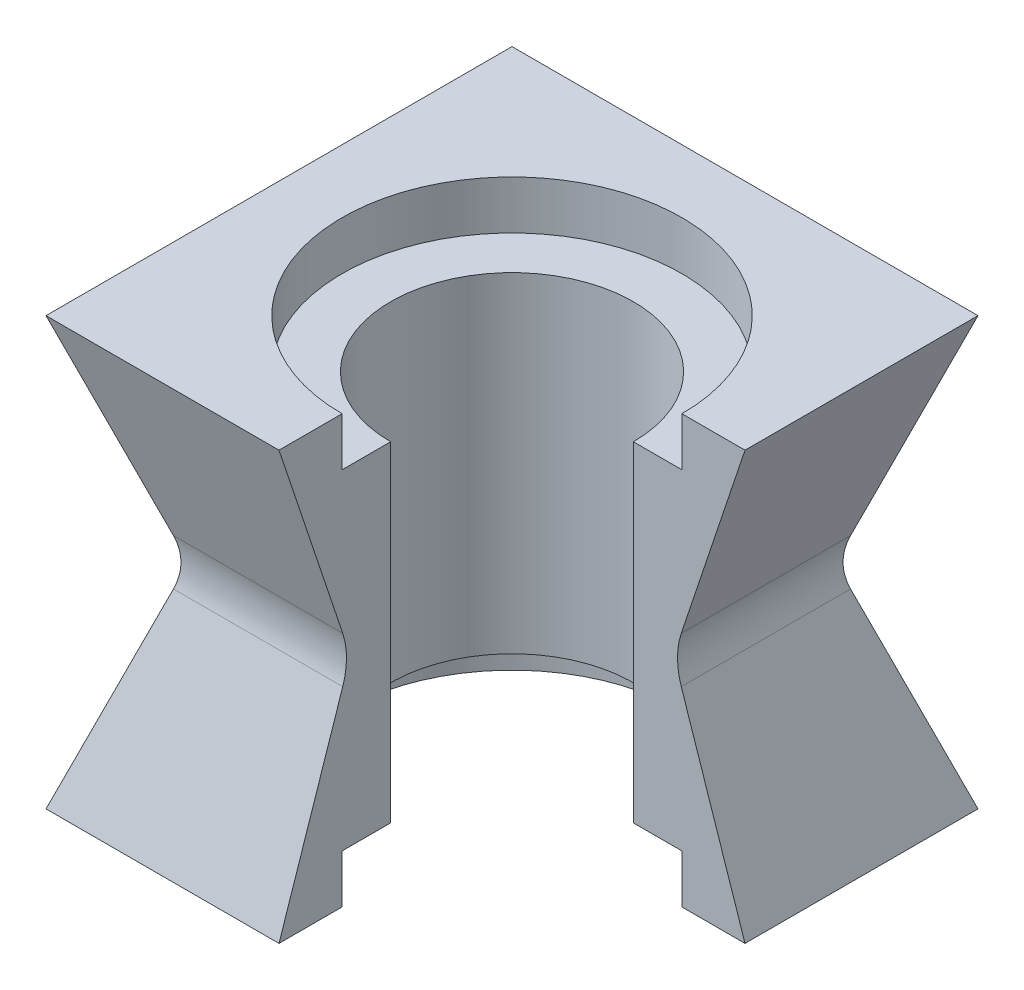
ISO-10303-21;
HEADER;
FILE_DESCRIPTION(('STEP AP214'),'2;1');
FILE_NAME('part.step','',(''),(''),'','','');
FILE_SCHEMA(('AUTOMOTIVE_DESIGN { 1 0 10303 214 1 1 1 1 }'));
ENDSEC;
DATA;
#1=APPLICATION_CONTEXT('core data for automotive mechanical design processes');
#2=APPLICATION_PROTOCOL_DEFINITION('international standard','automotive_design',2000,#1);
#3=PRODUCT_CONTEXT('',#1,'mechanical');
#4=PRODUCT('Part','Part','',(#3));
#5=PRODUCT_RELATED_PRODUCT_CATEGORY('part','',(#4));
#6=PRODUCT_DEFINITION_FORMATION('','',#4);
#7=PRODUCT_DEFINITION_CONTEXT('part definition',#1,'design');
#8=PRODUCT_DEFINITION('design','',#6,#7);
#9=PRODUCT_DEFINITION_SHAPE('','',#8);
#10=(LENGTH_UNIT() NAMED_UNIT(*) SI_UNIT(.MILLI.,.METRE.));
#11=(NAMED_UNIT(*) PLANE_ANGLE_UNIT() SI_UNIT($,.RADIAN.));
#12=(NAMED_UNIT(*) SI_UNIT($,.STERADIAN.) SOLID_ANGLE_UNIT());
#13=UNCERTAINTY_MEASURE_WITH_UNIT(LENGTH_MEASURE(1.E-05),#10,'distance_accuracy_value','');
#14=(GEOMETRIC_REPRESENTATION_CONTEXT(3) GLOBAL_UNCERTAINTY_ASSIGNED_CONTEXT((#13)) GLOBAL_UNIT_ASSIGNED_CONTEXT((#10,
#11,#12)) REPRESENTATION_CONTEXT('',''));
#15=CARTESIAN_POINT('',(0.,0.,0.));
#16=DIRECTION('',(0.,0.,1.));
#17=DIRECTION('',(1.,0.,0.));
#18=AXIS2_PLACEMENT_3D('',#15,#16,#17);
#19=CARTESIAN_POINT('',(0.,-44.,0.));
#20=DIRECTION('',(0.,1.,0.));
#21=DIRECTION('',(0.,0.,1.));
#22=AXIS2_PLACEMENT_3D('',#19,#20,#21);
#23=CYLINDRICAL_SURFACE('',#22,25.);
#24=CARTESIAN_POINT('',(0.,-34.,0.));
#25=DIRECTION('',(0.,-1.,0.));
#26=DIRECTION('',(0.,0.,-1.));
#27=AXIS2_PLACEMENT_3D('',#24,#25,#26);
#28=CIRCLE('',#27,25.);
#29=CARTESIAN_POINT('',(0.,-34.,25.));
#30=VERTEX_POINT('',#29);
#31=CARTESIAN_POINT('',(25.,-34.,0.));
#32=VERTEX_POINT('',#31);
#33=EDGE_CURVE('E52',#30,#32,#28,.T.);
#34=ORIENTED_EDGE('',*,*,#33,.T.);
#35=DIRECTION('',(0.,1.,0.));
#36=VECTOR('',#35,1.);
#37=CARTESIAN_POINT('',(25.,-44.,0.));
#38=LINE('',#37,#36);
#39=CARTESIAN_POINT('',(25.,34.,0.));
#40=VERTEX_POINT('',#39);
#41=EDGE_CURVE('E159',#32,#40,#38,.T.);
#42=ORIENTED_EDGE('',*,*,#41,.T.);
#43=CARTESIAN_POINT('',(0.,34.,0.));
#44=DIRECTION('',(0.,1.,0.));
#45=DIRECTION('',(0.,0.,1.));
#46=AXIS2_PLACEMENT_3D('',#43,#44,#45);
#47=CIRCLE('',#46,25.);
#48=CARTESIAN_POINT('',(0.,34.,25.));
#49=VERTEX_POINT('',#48);
#50=EDGE_CURVE('E293',#49,#40,#47,.F.);
#51=ORIENTED_EDGE('',*,*,#50,.F.);
#52=DIRECTION('',(0.,1.,0.));
#53=VECTOR('',#52,1.);
#54=CARTESIAN_POINT('',(0.,-44.,25.));
#55=LINE('',#54,#53);
#56=EDGE_CURVE('E162',#49,#30,#55,.F.);
#57=ORIENTED_EDGE('',*,*,#56,.T.);
#58=EDGE_LOOP('',(#34,#42,#51,#57));
#59=FACE_BOUND('',#58,.T.);
#60=ADVANCED_FACE('F35',(#59),#23,.F.);
#61=CARTESIAN_POINT('',(-29.9273217317904,10.0135417766895,48.));
#62=DIRECTION('',(0.948323655206201,-0.317304656405087,0.));
#63=DIRECTION('',(0.317304656405087,0.948323655206201,0.));
#64=AXIS2_PLACEMENT_3D('',#61,#62,#63);
#65=PLANE('',#64);
#66=DIRECTION('',(0.302444342389869,0.903910858167284,-0.302444342389876));
#67=VECTOR('',#66,1.);
#68=CARTESIAN_POINT('',(-22.7991085415071,31.3175253497149,22.7991085415066));
#69=LINE('',#68,#67);
#70=CARTESIAN_POINT('',(-48.,-44.,48.));
#71=VERTEX_POINT('',#70);
#72=CARTESIAN_POINT('',(-34.8703357352494,-4.75956984607637,34.8703357352491));
#73=VERTEX_POINT('',#72);
#74=EDGE_CURVE('E245',#71,#73,#69,.T.);
#75=ORIENTED_EDGE('',*,*,#74,.T.);
#76=DIRECTION('',(0.,0.,-1.));
#77=VECTOR('',#76,1.);
#78=CARTESIAN_POINT('',(-34.8703357352494,-4.7595698460763,48.));
#79=LINE('',#78,#77);
#80=CARTESIAN_POINT('',(-34.8703357352494,-4.75956984607637,-34.8703357352491));
#81=VERTEX_POINT('',#80);
#82=EDGE_CURVE('E171',#73,#81,#79,.T.);
#83=ORIENTED_EDGE('',*,*,#82,.T.);
#84=DIRECTION('',(-0.302444342389869,-0.903910858167283,-0.302444342389877));
#85=VECTOR('',#84,1.);
#86=CARTESIAN_POINT('',(-22.7991085415071,31.3175253497149,-22.7991085415066));
#87=LINE('',#86,#85);
#88=CARTESIAN_POINT('',(-48.,-43.9999999999999,-48.));
#89=VERTEX_POINT('',#88);
#90=EDGE_CURVE('E243',#81,#89,#87,.T.);
#91=ORIENTED_EDGE('',*,*,#90,.T.);
#92=DIRECTION('',(0.,0.,-1.));
#93=VECTOR('',#92,1.);
#94=CARTESIAN_POINT('',(-48.,-44.,48.));
#95=LINE('',#94,#93);
#96=EDGE_CURVE('E234',#71,#89,#95,.T.);
#97=ORIENTED_EDGE('',*,*,#96,.F.);
#98=EDGE_LOOP('',(#75,#83,#91,#97));
#99=FACE_BOUND('',#98,.T.);
#100=ADVANCED_FACE('F276',(#99),#65,.F.);
#101=CARTESIAN_POINT('',(-29.9273217317904,-10.0135417766895,48.));
#102=DIRECTION('',(-0.948323655206201,-0.317304656405086,0.));
#103=DIRECTION('',(0.317304656405086,-0.948323655206201,0.));
#104=AXIS2_PLACEMENT_3D('',#101,#102,#103);
#105=PLANE('',#104);
#106=DIRECTION('',(0.302444342389869,-0.903910858167284,0.302444342389876));
#107=VECTOR('',#106,1.);
#108=CARTESIAN_POINT('',(-22.7991085415071,-31.3175253497149,-22.7991085415066));
#109=LINE('',#108,#107);
#110=CARTESIAN_POINT('',(-48.,44.,-48.));
#111=VERTEX_POINT('',#110);
#112=CARTESIAN_POINT('',(-34.8703357352494,4.75956984607644,-34.8703357352491));
#113=VERTEX_POINT('',#112);
#114=EDGE_CURVE('E248',#111,#113,#109,.T.);
#115=ORIENTED_EDGE('',*,*,#114,.T.);
#116=DIRECTION('',(0.,0.,-1.));
#117=VECTOR('',#116,1.);
#118=CARTESIAN_POINT('',(-34.8703357352494,4.7595698460763,48.));
#119=LINE('',#118,#117);
#120=CARTESIAN_POINT('',(-34.8703357352494,4.75956984607642,34.8703357352491));
#121=VERTEX_POINT('',#120);
#122=EDGE_CURVE('E180',#113,#121,#119,.F.);
#123=ORIENTED_EDGE('',*,*,#122,.T.);
#124=DIRECTION('',(-0.302444342389869,0.903910858167284,0.302444342389876));
#125=VECTOR('',#124,1.);
#126=CARTESIAN_POINT('',(-22.7991085415071,-31.3175253497149,22.7991085415066));
#127=LINE('',#126,#125);
#128=CARTESIAN_POINT('',(-48.,44.,48.));
#129=VERTEX_POINT('',#128);
#130=EDGE_CURVE('E251',#121,#129,#127,.T.);
#131=ORIENTED_EDGE('',*,*,#130,.T.);
#132=DIRECTION('',(0.,0.,-1.));
#133=VECTOR('',#132,1.);
#134=CARTESIAN_POINT('',(-48.,44.,48.));
#135=LINE('',#134,#133);
#136=EDGE_CURVE('E237',#129,#111,#135,.T.);
#137=ORIENTED_EDGE('',*,*,#136,.T.);
#138=EDGE_LOOP('',(#115,#123,#131,#137));
#139=FACE_BOUND('',#138,.T.);
#140=ADVANCED_FACE('F329',(#139),#105,.T.);
#141=CARTESIAN_POINT('',(48.,10.0135417766896,29.9273217317899));
#142=DIRECTION('',(0.,0.317304656405092,0.948323655206199));
#143=DIRECTION('',(0.,-0.948323655206199,0.317304656405092));
#144=AXIS2_PLACEMENT_3D('',#141,#142,#143);
#145=PLANE('',#144);
#146=DIRECTION('',(0.,-0.948323655206199,0.317304656405092));
#147=VECTOR('',#146,1.);
#148=CARTESIAN_POINT('',(0.,10.0135417766896,29.9273217317899));
#149=LINE('',#148,#147);
#150=CARTESIAN_POINT('',(0.,-4.75956984607637,34.8703357352491));
#151=VERTEX_POINT('',#150);
#152=CARTESIAN_POINT('',(0.,-44.,48.));
#153=VERTEX_POINT('',#152);
#154=EDGE_CURVE('E229',#151,#153,#149,.T.);
#155=ORIENTED_EDGE('',*,*,#154,.F.);
#156=DIRECTION('',(-1.,0.,0.));
#157=VECTOR('',#156,1.);
#158=CARTESIAN_POINT('',(48.,-4.75956984607637,34.8703357352491));
#159=LINE('',#158,#157);
#160=EDGE_CURVE('E190',#151,#73,#159,.T.);
#161=ORIENTED_EDGE('',*,*,#160,.T.);
#162=ORIENTED_EDGE('',*,*,#74,.F.);
#163=DIRECTION('',(-1.,0.,0.));
#164=VECTOR('',#163,1.);
#165=CARTESIAN_POINT('',(48.,-44.,48.));
#166=LINE('',#165,#164);
#167=EDGE_CURVE('E174',#153,#71,#166,.T.);
#168=ORIENTED_EDGE('',*,*,#167,.F.);
#169=EDGE_LOOP('',(#155,#161,#162,#168));
#170=FACE_BOUND('',#169,.T.);
#171=ADVANCED_FACE('F273',(#170),#145,.T.);
#172=CARTESIAN_POINT('',(48.,10.0135417766896,-29.9273217317899));
#173=DIRECTION('',(0.,0.317304656405093,-0.948323655206199));
#174=DIRECTION('',(0.,0.948323655206199,0.317304656405094));
#175=AXIS2_PLACEMENT_3D('',#172,#173,#174);
#176=PLANE('',#175);
#177=ORIENTED_EDGE('',*,*,#90,.F.);
#178=DIRECTION('',(-1.,0.,0.));
#179=VECTOR('',#178,1.);
#180=CARTESIAN_POINT('',(48.,-4.75956984607637,-34.8703357352491));
#181=LINE('',#180,#179);
#182=CARTESIAN_POINT('',(34.8703357352494,-4.75956984607628,-34.8703357352491));
#183=VERTEX_POINT('',#182);
#184=EDGE_CURVE('E184',#81,#183,#181,.F.);
#185=ORIENTED_EDGE('',*,*,#184,.T.);
#186=DIRECTION('',(-0.302444342389869,0.903910858167283,0.302444342389877));
#187=VECTOR('',#186,1.);
#188=CARTESIAN_POINT('',(31.5804762448966,5.07278374227817,-31.5804762448963));
#189=LINE('',#188,#187);
#190=CARTESIAN_POINT('',(48.,-44.,-48.));
#191=VERTEX_POINT('',#190);
#192=EDGE_CURVE('E253',#191,#183,#189,.T.);
#193=ORIENTED_EDGE('',*,*,#192,.F.);
#194=DIRECTION('',(-1.,0.,0.));
#195=VECTOR('',#194,1.);
#196=CARTESIAN_POINT('',(48.,-43.9999999999999,-48.));
#197=LINE('',#196,#195);
#198=EDGE_CURVE('E261',#191,#89,#197,.T.);
#199=ORIENTED_EDGE('',*,*,#198,.T.);
#200=EDGE_LOOP('',(#177,#185,#193,#199));
#201=FACE_BOUND('',#200,.T.);
#202=ADVANCED_FACE('F280',(#201),#176,.T.);
#203=CARTESIAN_POINT('',(48.,44.,0.));
#204=DIRECTION('',(0.,-1.,0.));
#205=DIRECTION('',(0.,0.,-1.));
#206=AXIS2_PLACEMENT_3D('',#203,#204,#205);
#207=PLANE('',#206);
#208=DIRECTION('',(0.,0.,1.));
#209=VECTOR('',#208,1.);
#210=CARTESIAN_POINT('',(0.,44.,48.));
#211=LINE('',#210,#209);
#212=CARTESIAN_POINT('',(0.,44.,35.));
#213=VERTEX_POINT('',#212);
#214=CARTESIAN_POINT('',(0.,44.,48.));
#215=VERTEX_POINT('',#214);
#216=EDGE_CURVE('E204',#213,#215,#211,.T.);
#217=ORIENTED_EDGE('',*,*,#216,.F.);
#218=CARTESIAN_POINT('',(0.,44.,0.));
#219=DIRECTION('',(0.,1.,0.));
#220=DIRECTION('',(0.,0.,1.));
#221=AXIS2_PLACEMENT_3D('',#218,#219,#220);
#222=CIRCLE('',#221,35.);
#223=CARTESIAN_POINT('',(35.,44.,0.));
#224=VERTEX_POINT('',#223);
#225=EDGE_CURVE('E295',#224,#213,#222,.T.);
#226=ORIENTED_EDGE('',*,*,#225,.F.);
#227=DIRECTION('',(-1.,0.,0.));
#228=VECTOR('',#227,1.);
#229=CARTESIAN_POINT('',(0.,44.,0.));
#230=LINE('',#229,#228);
#231=CARTESIAN_POINT('',(48.,44.,0.));
#232=VERTEX_POINT('',#231);
#233=EDGE_CURVE('E209',#232,#224,#230,.T.);
#234=ORIENTED_EDGE('',*,*,#233,.F.);
#235=DIRECTION('',(0.,0.,-1.));
#236=VECTOR('',#235,1.);
#237=CARTESIAN_POINT('',(48.,44.,48.));
#238=LINE('',#237,#236);
#239=CARTESIAN_POINT('',(48.,44.,-48.));
#240=VERTEX_POINT('',#239);
#241=EDGE_CURVE('E240',#232,#240,#238,.T.);
#242=ORIENTED_EDGE('',*,*,#241,.T.);
#243=DIRECTION('',(-1.,0.,0.));
#244=VECTOR('',#243,1.);
#245=CARTESIAN_POINT('',(48.,44.,-48.));
#246=LINE('',#245,#244);
#247=EDGE_CURVE('E258',#240,#111,#246,.T.);
#248=ORIENTED_EDGE('',*,*,#247,.T.);
#249=ORIENTED_EDGE('',*,*,#136,.F.);
#250=DIRECTION('',(-1.,0.,0.));
#251=VECTOR('',#250,1.);
#252=CARTESIAN_POINT('',(48.,44.,48.));
#253=LINE('',#252,#251);
#254=EDGE_CURVE('E169',#215,#129,#253,.T.);
#255=ORIENTED_EDGE('',*,*,#254,.F.);
#256=EDGE_LOOP('',(#217,#226,#234,#242,#248,#249,#255));
#257=FACE_BOUND('',#256,.T.);
#258=ADVANCED_FACE('F349',(#257),#207,.F.);
#259=CARTESIAN_POINT('',(48.,-10.0135417766896,29.9273217317899));
#260=DIRECTION('',(0.,0.317304656405093,-0.948323655206199));
#261=DIRECTION('',(0.,0.948323655206199,0.317304656405093));
#262=AXIS2_PLACEMENT_3D('',#259,#260,#261);
#263=PLANE('',#262);
#264=ORIENTED_EDGE('',*,*,#130,.F.);
#265=DIRECTION('',(-1.,0.,0.));
#266=VECTOR('',#265,1.);
#267=CARTESIAN_POINT('',(48.,4.75956984607641,34.8703357352491));
#268=LINE('',#267,#266);
#269=CARTESIAN_POINT('',(0.,4.75956984607641,34.8703357352491));
#270=VERTEX_POINT('',#269);
#271=EDGE_CURVE('E192',#121,#270,#268,.F.);
#272=ORIENTED_EDGE('',*,*,#271,.T.);
#273=DIRECTION('',(0.,0.948323655206199,0.317304656405093));
#274=VECTOR('',#273,1.);
#275=CARTESIAN_POINT('',(0.,-10.0135417766896,29.9273217317899));
#276=LINE('',#275,#274);
#277=EDGE_CURVE('E227',#270,#215,#276,.T.);
#278=ORIENTED_EDGE('',*,*,#277,.T.);
#279=ORIENTED_EDGE('',*,*,#254,.T.);
#280=EDGE_LOOP('',(#264,#272,#278,#279));
#281=FACE_BOUND('',#280,.T.);
#282=ADVANCED_FACE('F351',(#281),#263,.F.);
#283=CARTESIAN_POINT('',(48.,-44.,0.));
#284=DIRECTION('',(0.,-1.,0.));
#285=DIRECTION('',(0.,0.,-1.));
#286=AXIS2_PLACEMENT_3D('',#283,#284,#285);
#287=PLANE('',#286);
#288=CARTESIAN_POINT('',(0.,-44.,0.));
#289=DIRECTION('',(0.,-1.,0.));
#290=DIRECTION('',(0.,0.,-1.));
#291=AXIS2_PLACEMENT_3D('',#288,#289,#290);
#292=CIRCLE('',#291,35.);
#293=CARTESIAN_POINT('',(0.,-44.,35.));
#294=VERTEX_POINT('',#293);
#295=CARTESIAN_POINT('',(35.,-44.,0.));
#296=VERTEX_POINT('',#295);
#297=EDGE_CURVE('E163',#294,#296,#292,.T.);
#298=ORIENTED_EDGE('',*,*,#297,.F.);
#299=DIRECTION('',(0.,0.,1.));
#300=VECTOR('',#299,1.);
#301=CARTESIAN_POINT('',(0.,-44.,48.));
#302=LINE('',#301,#300);
#303=EDGE_CURVE('E217',#294,#153,#302,.T.);
#304=ORIENTED_EDGE('',*,*,#303,.T.);
#305=ORIENTED_EDGE('',*,*,#167,.T.);
#306=ORIENTED_EDGE('',*,*,#96,.T.);
#307=ORIENTED_EDGE('',*,*,#198,.F.);
#308=DIRECTION('',(0.,0.,-1.));
#309=VECTOR('',#308,1.);
#310=CARTESIAN_POINT('',(48.,-44.,48.));
#311=LINE('',#310,#309);
#312=CARTESIAN_POINT('',(48.,-44.,0.));
#313=VERTEX_POINT('',#312);
#314=EDGE_CURVE('E232',#313,#191,#311,.T.);
#315=ORIENTED_EDGE('',*,*,#314,.F.);
#316=DIRECTION('',(-1.,0.,0.));
#317=VECTOR('',#316,1.);
#318=CARTESIAN_POINT('',(0.,-44.,0.));
#319=LINE('',#318,#317);
#320=EDGE_CURVE('E220',#313,#296,#319,.T.);
#321=ORIENTED_EDGE('',*,*,#320,.T.);
#322=EDGE_LOOP('',(#298,#304,#305,#306,#307,#315,#321));
#323=FACE_BOUND('',#322,.T.);
#324=ADVANCED_FACE('F267',(#323),#287,.T.);
#325=CARTESIAN_POINT('',(48.,-10.0135417766896,-29.9273217317899));
#326=DIRECTION('',(0.,0.317304656405093,0.948323655206199));
#327=DIRECTION('',(0.,-0.948323655206199,0.317304656405093));
#328=AXIS2_PLACEMENT_3D('',#325,#326,#327);
#329=PLANE('',#328);
#330=DIRECTION('',(0.302444342389869,0.903910858167283,-0.302444342389876));
#331=VECTOR('',#330,1.);
#332=CARTESIAN_POINT('',(31.5804762448966,-5.07278374227814,-31.5804762448963));
#333=LINE('',#332,#331);
#334=CARTESIAN_POINT('',(34.8703357352494,4.75956984607631,-34.8703357352491));
#335=VERTEX_POINT('',#334);
#336=EDGE_CURVE('E256',#335,#240,#333,.T.);
#337=ORIENTED_EDGE('',*,*,#336,.F.);
#338=DIRECTION('',(-1.,0.,0.));
#339=VECTOR('',#338,1.);
#340=CARTESIAN_POINT('',(48.,4.75956984607643,-34.8703357352491));
#341=LINE('',#340,#339);
#342=EDGE_CURVE('E182',#335,#113,#341,.T.);
#343=ORIENTED_EDGE('',*,*,#342,.T.);
#344=ORIENTED_EDGE('',*,*,#114,.F.);
#345=ORIENTED_EDGE('',*,*,#247,.F.);
#346=EDGE_LOOP('',(#337,#343,#344,#345));
#347=FACE_BOUND('',#346,.T.);
#348=ADVANCED_FACE('F342',(#347),#329,.F.);
#349=CARTESIAN_POINT('',(29.9273217317904,-10.0135417766895,48.));
#350=DIRECTION('',(0.948323655206201,-0.317304656405087,0.));
#351=DIRECTION('',(0.317304656405087,0.948323655206201,0.));
#352=AXIS2_PLACEMENT_3D('',#349,#350,#351);
#353=PLANE('',#352);
#354=DIRECTION('',(0.317304656405087,0.948323655206201,0.));
#355=VECTOR('',#354,1.);
#356=CARTESIAN_POINT('',(29.9273217317904,-10.0135417766895,0.));
#357=LINE('',#356,#355);
#358=CARTESIAN_POINT('',(34.8703357352494,4.75956984607631,0.));
#359=VERTEX_POINT('',#358);
#360=EDGE_CURVE('E225',#359,#232,#357,.T.);
#361=ORIENTED_EDGE('',*,*,#360,.F.);
#362=DIRECTION('',(0.,0.,-1.));
#363=VECTOR('',#362,1.);
#364=CARTESIAN_POINT('',(34.8703357352494,4.75956984607631,48.));
#365=LINE('',#364,#363);
#366=EDGE_CURVE('E186',#359,#335,#365,.T.);
#367=ORIENTED_EDGE('',*,*,#366,.T.);
#368=ORIENTED_EDGE('',*,*,#336,.T.);
#369=ORIENTED_EDGE('',*,*,#241,.F.);
#370=EDGE_LOOP('',(#361,#367,#368,#369));
#371=FACE_BOUND('',#370,.T.);
#372=ADVANCED_FACE('F335',(#371),#353,.T.);
#373=CARTESIAN_POINT('',(29.9273217317904,10.0135417766895,48.));
#374=DIRECTION('',(-0.948323655206201,-0.317304656405086,0.));
#375=DIRECTION('',(0.317304656405086,-0.948323655206201,0.));
#376=AXIS2_PLACEMENT_3D('',#373,#374,#375);
#377=PLANE('',#376);
#378=ORIENTED_EDGE('',*,*,#192,.T.);
#379=DIRECTION('',(0.,0.,-1.));
#380=VECTOR('',#379,1.);
#381=CARTESIAN_POINT('',(34.8703357352494,-4.75956984607628,48.));
#382=LINE('',#381,#380);
#383=CARTESIAN_POINT('',(34.8703357352494,-4.75956984607629,0.));
#384=VERTEX_POINT('',#383);
#385=EDGE_CURVE('E188',#183,#384,#382,.F.);
#386=ORIENTED_EDGE('',*,*,#385,.T.);
#387=DIRECTION('',(0.317304656405086,-0.948323655206201,0.));
#388=VECTOR('',#387,1.);
#389=CARTESIAN_POINT('',(29.9273217317904,10.0135417766895,0.));
#390=LINE('',#389,#388);
#391=EDGE_CURVE('E223',#384,#313,#390,.T.);
#392=ORIENTED_EDGE('',*,*,#391,.T.);
#393=ORIENTED_EDGE('',*,*,#314,.T.);
#394=EDGE_LOOP('',(#378,#386,#392,#393));
#395=FACE_BOUND('',#394,.T.);
#396=ADVANCED_FACE('F285',(#395),#377,.F.);
#397=CARTESIAN_POINT('',(0.,-44.,0.));
#398=DIRECTION('',(0.,0.,-1.));
#399=DIRECTION('',(-1.,0.,0.));
#400=AXIS2_PLACEMENT_3D('',#397,#398,#399);
#401=PLANE('',#400);
#402=DIRECTION('',(-1.,0.,0.));
#403=VECTOR('',#402,1.);
#404=CARTESIAN_POINT('',(48.,-34.,0.));
#405=LINE('',#404,#403);
#406=CARTESIAN_POINT('',(35.,-34.,0.));
#407=VERTEX_POINT('',#406);
#408=EDGE_CURVE('E149',#407,#32,#405,.T.);
#409=ORIENTED_EDGE('',*,*,#408,.F.);
#410=DIRECTION('',(0.,-1.,0.));
#411=VECTOR('',#410,1.);
#412=CARTESIAN_POINT('',(35.,-34.,0.));
#413=LINE('',#412,#411);
#414=EDGE_CURVE('E289',#407,#296,#413,.T.);
#415=ORIENTED_EDGE('',*,*,#414,.T.);
#416=ORIENTED_EDGE('',*,*,#320,.F.);
#417=ORIENTED_EDGE('',*,*,#391,.F.);
#418=CARTESIAN_POINT('',(49.0951905633424,0.,0.));
#419=DIRECTION('',(0.,0.,-1.));
#420=DIRECTION('',(-1.,0.,0.));
#421=AXIS2_PLACEMENT_3D('',#418,#419,#420);
#422=CIRCLE('',#421,15.);
#423=EDGE_CURVE('E44',#384,#359,#422,.T.);
#424=ORIENTED_EDGE('',*,*,#423,.T.);
#425=ORIENTED_EDGE('',*,*,#360,.T.);
#426=ORIENTED_EDGE('',*,*,#233,.T.);
#427=DIRECTION('',(0.,1.,0.));
#428=VECTOR('',#427,1.);
#429=CARTESIAN_POINT('',(35.,34.,0.));
#430=LINE('',#429,#428);
#431=CARTESIAN_POINT('',(35.,34.,0.));
#432=VERTEX_POINT('',#431);
#433=EDGE_CURVE('E291',#432,#224,#430,.T.);
#434=ORIENTED_EDGE('',*,*,#433,.F.);
#435=DIRECTION('',(1.,0.,0.));
#436=VECTOR('',#435,1.);
#437=CARTESIAN_POINT('',(0.,34.,0.));
#438=LINE('',#437,#436);
#439=EDGE_CURVE('E168',#40,#432,#438,.T.);
#440=ORIENTED_EDGE('',*,*,#439,.F.);
#441=ORIENTED_EDGE('',*,*,#41,.F.);
#442=EDGE_LOOP('',(#409,#415,#416,#417,#424,#425,#426,#434,#440,#441));
#443=FACE_BOUND('',#442,.T.);
#444=ADVANCED_FACE('F166',(#443),#401,.F.);
#445=CARTESIAN_POINT('',(0.,-44.,48.));
#446=DIRECTION('',(-1.,0.,0.));
#447=DIRECTION('',(0.,0.,1.));
#448=AXIS2_PLACEMENT_3D('',#445,#446,#447);
#449=PLANE('',#448);
#450=ORIENTED_EDGE('',*,*,#303,.F.);
#451=DIRECTION('',(0.,-1.,0.));
#452=VECTOR('',#451,1.);
#453=CARTESIAN_POINT('',(0.,-34.,35.));
#454=LINE('',#453,#452);
#455=CARTESIAN_POINT('',(0.,-34.,35.));
#456=VERTEX_POINT('',#455);
#457=EDGE_CURVE('E303',#456,#294,#454,.T.);
#458=ORIENTED_EDGE('',*,*,#457,.F.);
#459=DIRECTION('',(0.,0.,1.));
#460=VECTOR('',#459,1.);
#461=CARTESIAN_POINT('',(0.,-34.,0.));
#462=LINE('',#461,#460);
#463=EDGE_CURVE('E305',#30,#456,#462,.T.);
#464=ORIENTED_EDGE('',*,*,#463,.F.);
#465=ORIENTED_EDGE('',*,*,#56,.F.);
#466=DIRECTION('',(0.,0.,-1.));
#467=VECTOR('',#466,1.);
#468=CARTESIAN_POINT('',(0.,34.,0.));
#469=LINE('',#468,#467);
#470=CARTESIAN_POINT('',(0.,34.,35.));
#471=VERTEX_POINT('',#470);
#472=EDGE_CURVE('E298',#471,#49,#469,.T.);
#473=ORIENTED_EDGE('',*,*,#472,.F.);
#474=DIRECTION('',(0.,1.,0.));
#475=VECTOR('',#474,1.);
#476=CARTESIAN_POINT('',(0.,34.,35.));
#477=LINE('',#476,#475);
#478=EDGE_CURVE('E197',#471,#213,#477,.T.);
#479=ORIENTED_EDGE('',*,*,#478,.T.);
#480=ORIENTED_EDGE('',*,*,#216,.T.);
#481=ORIENTED_EDGE('',*,*,#277,.F.);
#482=CARTESIAN_POINT('',(0.,0.,49.0951905633421));
#483=DIRECTION('',(-1.,0.,0.));
#484=DIRECTION('',(0.,0.,1.));
#485=AXIS2_PLACEMENT_3D('',#482,#483,#484);
#486=CIRCLE('',#485,15.);
#487=EDGE_CURVE('E11',#270,#151,#486,.T.);
#488=ORIENTED_EDGE('',*,*,#487,.T.);
#489=ORIENTED_EDGE('',*,*,#154,.T.);
#490=EDGE_LOOP('',(#450,#458,#464,#465,#473,#479,#480,#481,#488,#489));
#491=FACE_BOUND('',#490,.T.);
#492=ADVANCED_FACE('F309',(#491),#449,.F.);
#493=CARTESIAN_POINT('',(49.0951905633424,0.,48.));
#494=DIRECTION('',(0.,0.,-1.));
#495=DIRECTION('',(-1.,0.,0.));
#496=AXIS2_PLACEMENT_3D('',#493,#494,#495);
#497=CYLINDRICAL_SURFACE('',#496,15.);
#498=ORIENTED_EDGE('',*,*,#423,.F.);
#499=ORIENTED_EDGE('',*,*,#385,.F.);
#500=CARTESIAN_POINT('',(49.0951905633424,0.,-49.0951905633421));
#501=DIRECTION('',(-0.707106781186547,0.,-0.707106781186547));
#502=DIRECTION('',(0.707106781186547,0.,-0.707106781186547));
#503=AXIS2_PLACEMENT_3D('',#500,#501,#502);
#504=ELLIPSE('',#503,21.2132034355964,15.);
#505=EDGE_CURVE('E39',#335,#183,#504,.F.);
#506=ORIENTED_EDGE('',*,*,#505,.F.);
#507=ORIENTED_EDGE('',*,*,#366,.F.);
#508=EDGE_LOOP('',(#498,#499,#506,#507));
#509=FACE_BOUND('',#508,.T.);
#510=ADVANCED_FACE('F37',(#509),#497,.F.);
#511=CARTESIAN_POINT('',(48.,0.,49.0951905633421));
#512=DIRECTION('',(-1.,0.,0.));
#513=DIRECTION('',(0.,0.,1.));
#514=AXIS2_PLACEMENT_3D('',#511,#512,#513);
#515=CYLINDRICAL_SURFACE('',#514,15.);
#516=ORIENTED_EDGE('',*,*,#487,.F.);
#517=ORIENTED_EDGE('',*,*,#271,.F.);
#518=CARTESIAN_POINT('',(-49.0951905633424,0.,49.0951905633421));
#519=DIRECTION('',(-0.707106781186547,0.,-0.707106781186547));
#520=DIRECTION('',(-0.707106781186547,0.,0.707106781186547));
#521=AXIS2_PLACEMENT_3D('',#518,#519,#520);
#522=ELLIPSE('',#521,21.2132034355964,15.);
#523=EDGE_CURVE('E196',#73,#121,#522,.F.);
#524=ORIENTED_EDGE('',*,*,#523,.F.);
#525=ORIENTED_EDGE('',*,*,#160,.F.);
#526=EDGE_LOOP('',(#516,#517,#524,#525));
#527=FACE_BOUND('',#526,.T.);
#528=ADVANCED_FACE('F365',(#527),#515,.F.);
#529=CARTESIAN_POINT('',(48.,0.,-49.0951905633421));
#530=DIRECTION('',(-1.,0.,0.));
#531=DIRECTION('',(0.,0.,1.));
#532=AXIS2_PLACEMENT_3D('',#529,#530,#531);
#533=CYLINDRICAL_SURFACE('',#532,15.);
#534=ORIENTED_EDGE('',*,*,#505,.T.);
#535=ORIENTED_EDGE('',*,*,#184,.F.);
#536=CARTESIAN_POINT('',(-49.0951905633424,0.,-49.0951905633421));
#537=DIRECTION('',(-0.707106781186547,0.,0.707106781186547));
#538=DIRECTION('',(-0.707106781186547,0.,-0.707106781186547));
#539=AXIS2_PLACEMENT_3D('',#536,#537,#538);
#540=ELLIPSE('',#539,21.2132034355964,15.);
#541=EDGE_CURVE('E195',#113,#81,#540,.F.);
#542=ORIENTED_EDGE('',*,*,#541,.F.);
#543=ORIENTED_EDGE('',*,*,#342,.F.);
#544=EDGE_LOOP('',(#534,#535,#542,#543));
#545=FACE_BOUND('',#544,.T.);
#546=ADVANCED_FACE('F363',(#545),#533,.F.);
#547=CARTESIAN_POINT('',(-49.0951905633424,0.,48.));
#548=DIRECTION('',(0.,0.,-1.));
#549=DIRECTION('',(-1.,0.,0.));
#550=AXIS2_PLACEMENT_3D('',#547,#548,#549);
#551=CYLINDRICAL_SURFACE('',#550,15.);
#552=ORIENTED_EDGE('',*,*,#523,.T.);
#553=ORIENTED_EDGE('',*,*,#122,.F.);
#554=ORIENTED_EDGE('',*,*,#541,.T.);
#555=ORIENTED_EDGE('',*,*,#82,.F.);
#556=EDGE_LOOP('',(#552,#553,#554,#555));
#557=FACE_BOUND('',#556,.T.);
#558=ADVANCED_FACE('F360',(#557),#551,.F.);
#559=CARTESIAN_POINT('',(0.,34.,0.));
#560=DIRECTION('',(0.,1.,0.));
#561=DIRECTION('',(0.,0.,1.));
#562=AXIS2_PLACEMENT_3D('',#559,#560,#561);
#563=CYLINDRICAL_SURFACE('',#562,35.);
#564=ORIENTED_EDGE('',*,*,#225,.T.);
#565=ORIENTED_EDGE('',*,*,#478,.F.);
#566=CARTESIAN_POINT('',(0.,34.,0.));
#567=DIRECTION('',(0.,1.,0.));
#568=DIRECTION('',(0.,0.,1.));
#569=AXIS2_PLACEMENT_3D('',#566,#567,#568);
#570=CIRCLE('',#569,35.);
#571=EDGE_CURVE('E60',#432,#471,#570,.T.);
#572=ORIENTED_EDGE('',*,*,#571,.F.);
#573=ORIENTED_EDGE('',*,*,#433,.T.);
#574=EDGE_LOOP('',(#564,#565,#572,#573));
#575=FACE_BOUND('',#574,.T.);
#576=ADVANCED_FACE('F321',(#575),#563,.F.);
#577=CARTESIAN_POINT('',(0.,34.,0.));
#578=DIRECTION('',(0.,1.,0.));
#579=DIRECTION('',(0.,0.,1.));
#580=AXIS2_PLACEMENT_3D('',#577,#578,#579);
#581=PLANE('',#580);
#582=ORIENTED_EDGE('',*,*,#439,.T.);
#583=ORIENTED_EDGE('',*,*,#571,.T.);
#584=ORIENTED_EDGE('',*,*,#472,.T.);
#585=ORIENTED_EDGE('',*,*,#50,.T.);
#586=EDGE_LOOP('',(#582,#583,#584,#585));
#587=FACE_BOUND('',#586,.T.);
#588=ADVANCED_FACE('F313',(#587),#581,.T.);
#589=CARTESIAN_POINT('',(0.,-34.,0.));
#590=DIRECTION('',(0.,-1.,0.));
#591=DIRECTION('',(0.,0.,-1.));
#592=AXIS2_PLACEMENT_3D('',#589,#590,#591);
#593=CYLINDRICAL_SURFACE('',#592,35.);
#594=ORIENTED_EDGE('',*,*,#297,.T.);
#595=ORIENTED_EDGE('',*,*,#414,.F.);
#596=CARTESIAN_POINT('',(0.,-34.,0.));
#597=DIRECTION('',(0.,-1.,0.));
#598=DIRECTION('',(0.,0.,-1.));
#599=AXIS2_PLACEMENT_3D('',#596,#597,#598);
#600=CIRCLE('',#599,35.);
#601=EDGE_CURVE('E151',#456,#407,#600,.T.);
#602=ORIENTED_EDGE('',*,*,#601,.F.);
#603=ORIENTED_EDGE('',*,*,#457,.T.);
#604=EDGE_LOOP('',(#594,#595,#602,#603));
#605=FACE_BOUND('',#604,.T.);
#606=ADVANCED_FACE('F311',(#605),#593,.F.);
#607=CARTESIAN_POINT('',(0.,-34.,0.));
#608=DIRECTION('',(0.,-1.,0.));
#609=DIRECTION('',(0.,0.,-1.));
#610=AXIS2_PLACEMENT_3D('',#607,#608,#609);
#611=PLANE('',#610);
#612=ORIENTED_EDGE('',*,*,#33,.F.);
#613=ORIENTED_EDGE('',*,*,#463,.T.);
#614=ORIENTED_EDGE('',*,*,#601,.T.);
#615=ORIENTED_EDGE('',*,*,#408,.T.);
#616=EDGE_LOOP('',(#612,#613,#614,#615));
#617=FACE_BOUND('',#616,.T.);
#618=ADVANCED_FACE('F150',(#617),#611,.T.);
#619=CLOSED_SHELL('',(#60,#100,#140,#171,#202,#258,#282,#324,#348,#372,#396,#444,#492,#510,#528,
#546,#558,#576,#588,#606,#618));
#620=MANIFOLD_SOLID_BREP('B2',#619);
#621=ADVANCED_BREP_SHAPE_REPRESENTATION('',(#18,#620),#14);
#622=SHAPE_DEFINITION_REPRESENTATION(#9,#621);
ENDSEC;
END-ISO-10303-21;
